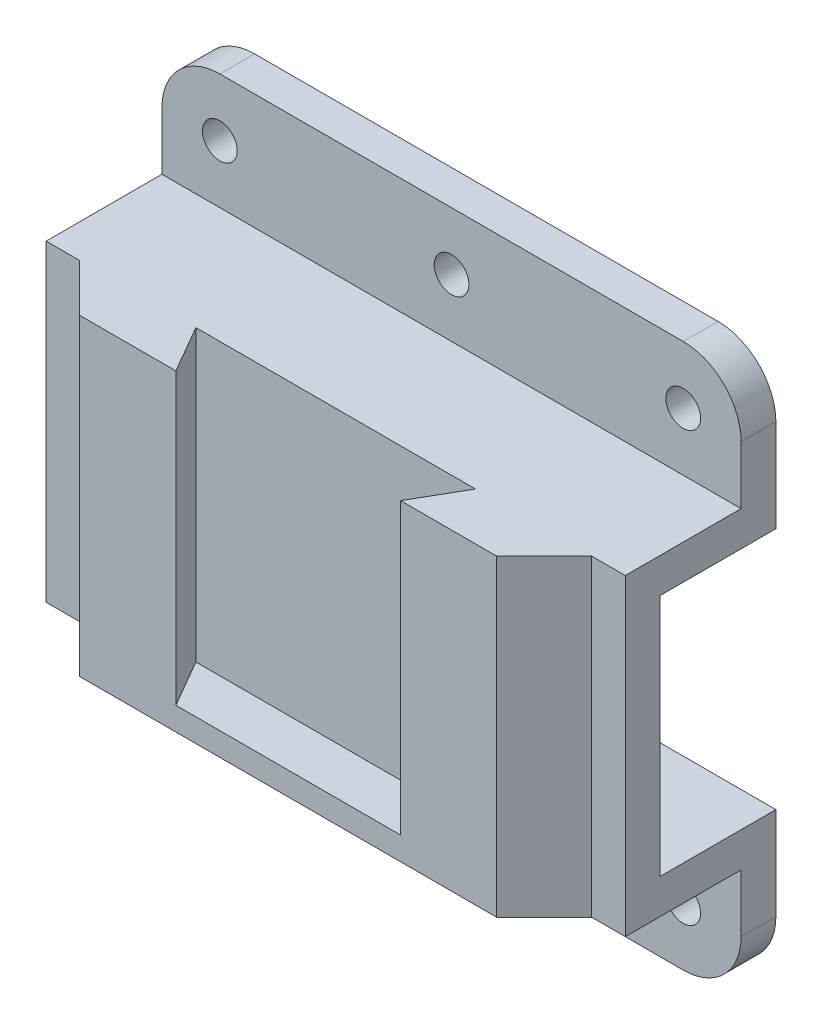
ISO-10303-21;
HEADER;
FILE_DESCRIPTION(('STEP AP214'),'2;1');
FILE_NAME('part.step','',(''),(''),'','','');
FILE_SCHEMA(('AUTOMOTIVE_DESIGN { 1 0 10303 214 1 1 1 1 }'));
ENDSEC;
DATA;
#1=APPLICATION_CONTEXT('core data for automotive mechanical design processes');
#2=APPLICATION_PROTOCOL_DEFINITION('international standard','automotive_design',2000,#1);
#3=PRODUCT_CONTEXT('',#1,'mechanical');
#4=PRODUCT('Part','Part','',(#3));
#5=PRODUCT_RELATED_PRODUCT_CATEGORY('part','',(#4));
#6=PRODUCT_DEFINITION_FORMATION('','',#4);
#7=PRODUCT_DEFINITION_CONTEXT('part definition',#1,'design');
#8=PRODUCT_DEFINITION('design','',#6,#7);
#9=PRODUCT_DEFINITION_SHAPE('','',#8);
#10=(LENGTH_UNIT() NAMED_UNIT(*) SI_UNIT(.MILLI.,.METRE.));
#11=(NAMED_UNIT(*) PLANE_ANGLE_UNIT() SI_UNIT($,.RADIAN.));
#12=(NAMED_UNIT(*) SI_UNIT($,.STERADIAN.) SOLID_ANGLE_UNIT());
#13=UNCERTAINTY_MEASURE_WITH_UNIT(LENGTH_MEASURE(1.E-05),#10,'distance_accuracy_value','');
#14=(GEOMETRIC_REPRESENTATION_CONTEXT(3) GLOBAL_UNCERTAINTY_ASSIGNED_CONTEXT((#13)) GLOBAL_UNIT_ASSIGNED_CONTEXT((#10,
#11,#12)) REPRESENTATION_CONTEXT('',''));
#15=CARTESIAN_POINT('',(0.,0.,0.));
#16=DIRECTION('',(0.,0.,1.));
#17=DIRECTION('',(1.,0.,0.));
#18=AXIS2_PLACEMENT_3D('',#15,#16,#17);
#19=CARTESIAN_POINT('',(50.,-13.5,13.));
#20=DIRECTION('',(0.,0.,-1.));
#21=DIRECTION('',(0.,1.,0.));
#22=AXIS2_PLACEMENT_3D('',#19,#20,#21);
#23=PLANE('',#22);
#24=DIRECTION('',(0.,1.,0.));
#25=VECTOR('',#24,1.);
#26=CARTESIAN_POINT('',(12.9328638963225,-13.5,13.));
#27=LINE('',#26,#25);
#28=CARTESIAN_POINT('',(12.9328638963225,-11.5,13.));
#29=VERTEX_POINT('',#28);
#30=CARTESIAN_POINT('',(12.9328638963225,13.5,13.));
#31=VERTEX_POINT('',#30);
#32=EDGE_CURVE('E211',#29,#31,#27,.T.);
#33=ORIENTED_EDGE('',*,*,#32,.F.);
#34=DIRECTION('',(1.,0.,0.));
#35=VECTOR('',#34,1.);
#36=CARTESIAN_POINT('',(12.9328638963225,-11.5,13.));
#37=LINE('',#36,#35);
#38=CARTESIAN_POINT('',(37.0671361036774,-11.5,13.));
#39=VERTEX_POINT('',#38);
#40=EDGE_CURVE('E195',#29,#39,#37,.T.);
#41=ORIENTED_EDGE('',*,*,#40,.T.);
#42=DIRECTION('',(0.,1.,0.));
#43=VECTOR('',#42,1.);
#44=CARTESIAN_POINT('',(37.0671361036774,-13.5,13.));
#45=LINE('',#44,#43);
#46=CARTESIAN_POINT('',(37.0671361036774,13.5,13.));
#47=VERTEX_POINT('',#46);
#48=EDGE_CURVE('E409',#39,#47,#45,.T.);
#49=ORIENTED_EDGE('',*,*,#48,.T.);
#50=DIRECTION('',(-1.,0.,0.));
#51=VECTOR('',#50,1.);
#52=CARTESIAN_POINT('',(50.,13.5,13.));
#53=LINE('',#52,#51);
#54=EDGE_CURVE('E217',#47,#31,#53,.T.);
#55=ORIENTED_EDGE('',*,*,#54,.T.);
#56=EDGE_LOOP('',(#33,#41,#49,#55));
#57=FACE_BOUND('',#56,.T.);
#58=ADVANCED_FACE('F39',(#57),#23,.F.);
#59=CARTESIAN_POINT('',(50.,13.5,13.));
#60=VERTEX_POINT('',#59);
#61=CARTESIAN_POINT('',(47.1,13.5,13.));
#62=VERTEX_POINT('',#61);
#63=EDGE_CURVE('E322',#60,#62,#53,.T.);
#64=ORIENTED_EDGE('',*,*,#63,.T.);
#65=DIRECTION('',(0.,-1.,0.));
#66=VECTOR('',#65,1.);
#67=CARTESIAN_POINT('',(47.1,-13.5,13.));
#68=LINE('',#67,#66);
#69=CARTESIAN_POINT('',(47.1,-13.5,13.));
#70=VERTEX_POINT('',#69);
#71=EDGE_CURVE('E11',#62,#70,#68,.T.);
#72=ORIENTED_EDGE('',*,*,#71,.T.);
#73=DIRECTION('',(-1.,0.,0.));
#74=VECTOR('',#73,1.);
#75=CARTESIAN_POINT('',(50.,-13.5,13.));
#76=LINE('',#75,#74);
#77=CARTESIAN_POINT('',(50.,-13.5,13.));
#78=VERTEX_POINT('',#77);
#79=EDGE_CURVE('E319',#78,#70,#76,.T.);
#80=ORIENTED_EDGE('',*,*,#79,.F.);
#81=DIRECTION('',(0.,-1.,0.));
#82=VECTOR('',#81,1.);
#83=CARTESIAN_POINT('',(50.,5.,13.));
#84=LINE('',#83,#82);
#85=EDGE_CURVE('E266',#60,#78,#84,.T.);
#86=ORIENTED_EDGE('',*,*,#85,.F.);
#87=EDGE_LOOP('',(#64,#72,#80,#86));
#88=FACE_BOUND('',#87,.T.);
#89=ADVANCED_FACE('F435',(#88),#23,.F.);
#90=CARTESIAN_POINT('',(0.,0.,0.));
#91=DIRECTION('',(1.,0.,0.));
#92=DIRECTION('',(0.,0.,-1.));
#93=AXIS2_PLACEMENT_3D('',#90,#91,#92);
#94=PLANE('',#93);
#95=DIRECTION('',(0.,0.,-1.));
#96=VECTOR('',#95,1.);
#97=CARTESIAN_POINT('',(0.,-13.5,3.00000000000001));
#98=LINE('',#97,#96);
#99=CARTESIAN_POINT('',(0.,-13.5,13.));
#100=VERTEX_POINT('',#99);
#101=CARTESIAN_POINT('',(0.,-13.5,3.00000000000001));
#102=VERTEX_POINT('',#101);
#103=EDGE_CURVE('E292',#100,#102,#98,.T.);
#104=ORIENTED_EDGE('',*,*,#103,.F.);
#105=DIRECTION('',(0.,-1.,0.));
#106=VECTOR('',#105,1.);
#107=CARTESIAN_POINT('',(0.,5.,13.));
#108=LINE('',#107,#106);
#109=CARTESIAN_POINT('',(0.,13.5,13.));
#110=VERTEX_POINT('',#109);
#111=EDGE_CURVE('E290',#110,#100,#108,.T.);
#112=ORIENTED_EDGE('',*,*,#111,.F.);
#113=DIRECTION('',(0.,0.,1.));
#114=VECTOR('',#113,1.);
#115=CARTESIAN_POINT('',(0.,13.5,3.));
#116=LINE('',#115,#114);
#117=CARTESIAN_POINT('',(0.,13.5,3.));
#118=VERTEX_POINT('',#117);
#119=EDGE_CURVE('E287',#118,#110,#116,.T.);
#120=ORIENTED_EDGE('',*,*,#119,.F.);
#121=DIRECTION('',(0.,-1.,0.));
#122=VECTOR('',#121,1.);
#123=CARTESIAN_POINT('',(0.,23.5,3.));
#124=LINE('',#123,#122);
#125=CARTESIAN_POINT('',(0.,18.5,3.));
#126=VERTEX_POINT('',#125);
#127=EDGE_CURVE('E285',#126,#118,#124,.T.);
#128=ORIENTED_EDGE('',*,*,#127,.F.);
#129=DIRECTION('',(0.,0.,1.));
#130=VECTOR('',#129,1.);
#131=CARTESIAN_POINT('',(0.,18.5,0.));
#132=LINE('',#131,#130);
#133=CARTESIAN_POINT('',(0.,18.5,0.));
#134=VERTEX_POINT('',#133);
#135=EDGE_CURVE('E346',#126,#134,#132,.F.);
#136=ORIENTED_EDGE('',*,*,#135,.T.);
#137=DIRECTION('',(0.,1.,0.));
#138=VECTOR('',#137,1.);
#139=CARTESIAN_POINT('',(0.,10.5,0.));
#140=LINE('',#139,#138);
#141=CARTESIAN_POINT('',(0.,10.5,0.));
#142=VERTEX_POINT('',#141);
#143=EDGE_CURVE('E282',#142,#134,#140,.T.);
#144=ORIENTED_EDGE('',*,*,#143,.F.);
#145=DIRECTION('',(0.,0.,-1.));
#146=VECTOR('',#145,1.);
#147=CARTESIAN_POINT('',(0.,10.5,10.));
#148=LINE('',#147,#146);
#149=CARTESIAN_POINT('',(0.,10.5,10.));
#150=VERTEX_POINT('',#149);
#151=EDGE_CURVE('E254',#150,#142,#148,.T.);
#152=ORIENTED_EDGE('',*,*,#151,.F.);
#153=DIRECTION('',(0.,1.,0.));
#154=VECTOR('',#153,1.);
#155=CARTESIAN_POINT('',(0.,-10.5,10.));
#156=LINE('',#155,#154);
#157=CARTESIAN_POINT('',(0.,-10.5,10.));
#158=VERTEX_POINT('',#157);
#159=EDGE_CURVE('E259',#158,#150,#156,.T.);
#160=ORIENTED_EDGE('',*,*,#159,.F.);
#161=DIRECTION('',(0.,0.,1.));
#162=VECTOR('',#161,1.);
#163=CARTESIAN_POINT('',(0.,-10.5,10.));
#164=LINE('',#163,#162);
#165=CARTESIAN_POINT('',(0.,-10.5,0.));
#166=VERTEX_POINT('',#165);
#167=EDGE_CURVE('E299',#166,#158,#164,.T.);
#168=ORIENTED_EDGE('',*,*,#167,.F.);
#169=DIRECTION('',(0.,1.,0.));
#170=VECTOR('',#169,1.);
#171=CARTESIAN_POINT('',(0.,-10.5,0.));
#172=LINE('',#171,#170);
#173=CARTESIAN_POINT('',(0.,-18.5,0.));
#174=VERTEX_POINT('',#173);
#175=EDGE_CURVE('E297',#174,#166,#172,.T.);
#176=ORIENTED_EDGE('',*,*,#175,.F.);
#177=DIRECTION('',(0.,0.,-1.));
#178=VECTOR('',#177,1.);
#179=CARTESIAN_POINT('',(0.,-18.5,0.));
#180=LINE('',#179,#178);
#181=CARTESIAN_POINT('',(0.,-18.5,3.00000000000001));
#182=VERTEX_POINT('',#181);
#183=EDGE_CURVE('E348',#174,#182,#180,.F.);
#184=ORIENTED_EDGE('',*,*,#183,.T.);
#185=DIRECTION('',(0.,-1.,0.));
#186=VECTOR('',#185,1.);
#187=CARTESIAN_POINT('',(0.,-23.5,3.00000000000001));
#188=LINE('',#187,#186);
#189=EDGE_CURVE('E294',#102,#182,#188,.T.);
#190=ORIENTED_EDGE('',*,*,#189,.F.);
#191=EDGE_LOOP('',(#104,#112,#120,#128,#136,#144,#152,#160,#168,#176,#184,#190));
#192=FACE_BOUND('',#191,.T.);
#193=ADVANCED_FACE('F449',(#192),#94,.F.);
#194=CARTESIAN_POINT('',(50.,0.,0.));
#195=DIRECTION('',(1.,0.,0.));
#196=DIRECTION('',(0.,0.,-1.));
#197=AXIS2_PLACEMENT_3D('',#194,#195,#196);
#198=PLANE('',#197);
#199=ORIENTED_EDGE('',*,*,#85,.T.);
#200=DIRECTION('',(0.,0.,-1.));
#201=VECTOR('',#200,1.);
#202=CARTESIAN_POINT('',(50.,-13.5,3.00000000000001));
#203=LINE('',#202,#201);
#204=CARTESIAN_POINT('',(50.,-13.5,3.00000000000001));
#205=VERTEX_POINT('',#204);
#206=EDGE_CURVE('E268',#78,#205,#203,.T.);
#207=ORIENTED_EDGE('',*,*,#206,.T.);
#208=DIRECTION('',(0.,-1.,0.));
#209=VECTOR('',#208,1.);
#210=CARTESIAN_POINT('',(50.,-23.5,3.00000000000001));
#211=LINE('',#210,#209);
#212=CARTESIAN_POINT('',(50.,-18.5,3.00000000000001));
#213=VERTEX_POINT('',#212);
#214=EDGE_CURVE('E270',#205,#213,#211,.T.);
#215=ORIENTED_EDGE('',*,*,#214,.T.);
#216=DIRECTION('',(0.,0.,-1.));
#217=VECTOR('',#216,1.);
#218=CARTESIAN_POINT('',(50.,-18.5,0.));
#219=LINE('',#218,#217);
#220=CARTESIAN_POINT('',(50.,-18.5,0.));
#221=VERTEX_POINT('',#220);
#222=EDGE_CURVE('E357',#213,#221,#219,.T.);
#223=ORIENTED_EDGE('',*,*,#222,.T.);
#224=DIRECTION('',(0.,1.,0.));
#225=VECTOR('',#224,1.);
#226=CARTESIAN_POINT('',(50.,-10.5,0.));
#227=LINE('',#226,#225);
#228=CARTESIAN_POINT('',(50.,-10.5,0.));
#229=VERTEX_POINT('',#228);
#230=EDGE_CURVE('E273',#221,#229,#227,.T.);
#231=ORIENTED_EDGE('',*,*,#230,.T.);
#232=DIRECTION('',(0.,0.,1.));
#233=VECTOR('',#232,1.);
#234=CARTESIAN_POINT('',(50.,-10.5,10.));
#235=LINE('',#234,#233);
#236=CARTESIAN_POINT('',(50.,-10.5,10.));
#237=VERTEX_POINT('',#236);
#238=EDGE_CURVE('E275',#229,#237,#235,.T.);
#239=ORIENTED_EDGE('',*,*,#238,.T.);
#240=DIRECTION('',(0.,1.,0.));
#241=VECTOR('',#240,1.);
#242=CARTESIAN_POINT('',(50.,-10.5,10.));
#243=LINE('',#242,#241);
#244=CARTESIAN_POINT('',(50.,10.5,10.));
#245=VERTEX_POINT('',#244);
#246=EDGE_CURVE('E277',#237,#245,#243,.T.);
#247=ORIENTED_EDGE('',*,*,#246,.T.);
#248=DIRECTION('',(0.,0.,-1.));
#249=VECTOR('',#248,1.);
#250=CARTESIAN_POINT('',(50.,10.5,10.));
#251=LINE('',#250,#249);
#252=CARTESIAN_POINT('',(50.,10.5,0.));
#253=VERTEX_POINT('',#252);
#254=EDGE_CURVE('E255',#245,#253,#251,.T.);
#255=ORIENTED_EDGE('',*,*,#254,.T.);
#256=DIRECTION('',(0.,1.,0.));
#257=VECTOR('',#256,1.);
#258=CARTESIAN_POINT('',(50.,10.5,0.));
#259=LINE('',#258,#257);
#260=CARTESIAN_POINT('',(50.,18.5,0.));
#261=VERTEX_POINT('',#260);
#262=EDGE_CURVE('E258',#253,#261,#259,.T.);
#263=ORIENTED_EDGE('',*,*,#262,.T.);
#264=DIRECTION('',(0.,0.,1.));
#265=VECTOR('',#264,1.);
#266=CARTESIAN_POINT('',(50.,18.5,3.));
#267=LINE('',#266,#265);
#268=CARTESIAN_POINT('',(50.,18.5,3.));
#269=VERTEX_POINT('',#268);
#270=EDGE_CURVE('E354',#261,#269,#267,.T.);
#271=ORIENTED_EDGE('',*,*,#270,.T.);
#272=DIRECTION('',(0.,-1.,0.));
#273=VECTOR('',#272,1.);
#274=CARTESIAN_POINT('',(50.,23.5,3.));
#275=LINE('',#274,#273);
#276=CARTESIAN_POINT('',(50.,13.5,3.));
#277=VERTEX_POINT('',#276);
#278=EDGE_CURVE('E262',#269,#277,#275,.T.);
#279=ORIENTED_EDGE('',*,*,#278,.T.);
#280=DIRECTION('',(0.,0.,1.));
#281=VECTOR('',#280,1.);
#282=CARTESIAN_POINT('',(50.,13.5,3.));
#283=LINE('',#282,#281);
#284=EDGE_CURVE('E264',#277,#60,#283,.T.);
#285=ORIENTED_EDGE('',*,*,#284,.T.);
#286=EDGE_LOOP('',(#199,#207,#215,#223,#231,#239,#247,#255,#263,#271,#279,#285));
#287=FACE_BOUND('',#286,.T.);
#288=ADVANCED_FACE('F439',(#287),#198,.T.);
#289=CARTESIAN_POINT('',(50.,10.5,10.));
#290=DIRECTION('',(0.,1.,0.));
#291=DIRECTION('',(0.,0.,1.));
#292=AXIS2_PLACEMENT_3D('',#289,#290,#291);
#293=PLANE('',#292);
#294=ORIENTED_EDGE('',*,*,#151,.T.);
#295=DIRECTION('',(-1.,0.,0.));
#296=VECTOR('',#295,1.);
#297=CARTESIAN_POINT('',(50.,10.5,0.));
#298=LINE('',#297,#296);
#299=EDGE_CURVE('E334',#253,#142,#298,.T.);
#300=ORIENTED_EDGE('',*,*,#299,.F.);
#301=ORIENTED_EDGE('',*,*,#254,.F.);
#302=DIRECTION('',(-1.,0.,0.));
#303=VECTOR('',#302,1.);
#304=CARTESIAN_POINT('',(50.,10.5,10.));
#305=LINE('',#304,#303);
#306=EDGE_CURVE('E279',#245,#150,#305,.T.);
#307=ORIENTED_EDGE('',*,*,#306,.T.);
#308=EDGE_LOOP('',(#294,#300,#301,#307));
#309=FACE_BOUND('',#308,.T.);
#310=ADVANCED_FACE('F491',(#309),#293,.F.);
#311=CARTESIAN_POINT('',(50.,10.5,0.));
#312=DIRECTION('',(0.,0.,1.));
#313=DIRECTION('',(1.,0.,0.));
#314=AXIS2_PLACEMENT_3D('',#311,#312,#313);
#315=PLANE('',#314);
#316=CARTESIAN_POINT('',(25.,18.5,0.));
#317=DIRECTION('',(0.,0.,1.));
#318=DIRECTION('',(1.,0.,0.));
#319=AXIS2_PLACEMENT_3D('',#316,#317,#318);
#320=CIRCLE('',#319,1.5);
#321=CARTESIAN_POINT('',(26.5,18.5,0.));
#322=VERTEX_POINT('',#321);
#323=EDGE_CURVE('E244',#322,#322,#320,.T.);
#324=ORIENTED_EDGE('',*,*,#323,.T.);
#325=EDGE_LOOP('',(#324));
#326=FACE_BOUND('',#325,.T.);
#327=CARTESIAN_POINT('',(45.,18.5,0.));
#328=DIRECTION('',(0.,0.,1.));
#329=DIRECTION('',(1.,0.,0.));
#330=AXIS2_PLACEMENT_3D('',#327,#328,#329);
#331=CIRCLE('',#330,1.5);
#332=CARTESIAN_POINT('',(46.5,18.5,0.));
#333=VERTEX_POINT('',#332);
#334=EDGE_CURVE('E241',#333,#333,#331,.T.);
#335=ORIENTED_EDGE('',*,*,#334,.T.);
#336=EDGE_LOOP('',(#335));
#337=FACE_BOUND('',#336,.T.);
#338=CARTESIAN_POINT('',(5.,18.5,0.));
#339=DIRECTION('',(0.,0.,1.));
#340=DIRECTION('',(1.,0.,0.));
#341=AXIS2_PLACEMENT_3D('',#338,#339,#340);
#342=CIRCLE('',#341,1.5);
#343=CARTESIAN_POINT('',(6.5,18.5,0.));
#344=VERTEX_POINT('',#343);
#345=EDGE_CURVE('E251',#344,#344,#342,.T.);
#346=ORIENTED_EDGE('',*,*,#345,.T.);
#347=EDGE_LOOP('',(#346));
#348=FACE_BOUND('',#347,.T.);
#349=ORIENTED_EDGE('',*,*,#143,.T.);
#350=CARTESIAN_POINT('',(5.,18.5,0.));
#351=DIRECTION('',(0.,0.,1.));
#352=DIRECTION('',(1.,0.,0.));
#353=AXIS2_PLACEMENT_3D('',#350,#351,#352);
#354=CIRCLE('',#353,5.);
#355=CARTESIAN_POINT('',(5.,23.5,0.));
#356=VERTEX_POINT('',#355);
#357=EDGE_CURVE('E371',#134,#356,#354,.F.);
#358=ORIENTED_EDGE('',*,*,#357,.T.);
#359=DIRECTION('',(-1.,0.,0.));
#360=VECTOR('',#359,1.);
#361=CARTESIAN_POINT('',(50.,23.5,0.));
#362=LINE('',#361,#360);
#363=CARTESIAN_POINT('',(45.,23.5,0.));
#364=VERTEX_POINT('',#363);
#365=EDGE_CURVE('E331',#364,#356,#362,.T.);
#366=ORIENTED_EDGE('',*,*,#365,.F.);
#367=CARTESIAN_POINT('',(45.,18.5,0.));
#368=DIRECTION('',(0.,0.,1.));
#369=DIRECTION('',(1.,0.,0.));
#370=AXIS2_PLACEMENT_3D('',#367,#368,#369);
#371=CIRCLE('',#370,5.);
#372=EDGE_CURVE('E369',#364,#261,#371,.F.);
#373=ORIENTED_EDGE('',*,*,#372,.T.);
#374=ORIENTED_EDGE('',*,*,#262,.F.);
#375=ORIENTED_EDGE('',*,*,#299,.T.);
#376=EDGE_LOOP('',(#349,#358,#366,#373,#374,#375));
#377=FACE_BOUND('',#376,.T.);
#378=ADVANCED_FACE('F493',(#326,#337,#348,#377),#315,.F.);
#379=CARTESIAN_POINT('',(50.,23.5,0.));
#380=DIRECTION('',(0.,-1.,0.));
#381=DIRECTION('',(0.,0.,-1.));
#382=AXIS2_PLACEMENT_3D('',#379,#380,#381);
#383=PLANE('',#382);
#384=ORIENTED_EDGE('',*,*,#365,.T.);
#385=DIRECTION('',(0.,0.,1.));
#386=VECTOR('',#385,1.);
#387=CARTESIAN_POINT('',(5.,23.5,0.));
#388=LINE('',#387,#386);
#389=CARTESIAN_POINT('',(5.,23.5,3.));
#390=VERTEX_POINT('',#389);
#391=EDGE_CURVE('E362',#356,#390,#388,.T.);
#392=ORIENTED_EDGE('',*,*,#391,.T.);
#393=DIRECTION('',(-1.,0.,0.));
#394=VECTOR('',#393,1.);
#395=CARTESIAN_POINT('',(50.,23.5,3.));
#396=LINE('',#395,#394);
#397=CARTESIAN_POINT('',(45.,23.5,3.));
#398=VERTEX_POINT('',#397);
#399=EDGE_CURVE('E328',#398,#390,#396,.T.);
#400=ORIENTED_EDGE('',*,*,#399,.F.);
#401=DIRECTION('',(0.,0.,1.));
#402=VECTOR('',#401,1.);
#403=CARTESIAN_POINT('',(45.,23.5,0.));
#404=LINE('',#403,#402);
#405=EDGE_CURVE('E360',#398,#364,#404,.F.);
#406=ORIENTED_EDGE('',*,*,#405,.T.);
#407=EDGE_LOOP('',(#384,#392,#400,#406));
#408=FACE_BOUND('',#407,.T.);
#409=ADVANCED_FACE('F503',(#408),#383,.F.);
#410=CARTESIAN_POINT('',(50.,23.5,3.));
#411=DIRECTION('',(0.,0.,-1.));
#412=DIRECTION('',(0.,1.,0.));
#413=AXIS2_PLACEMENT_3D('',#410,#411,#412);
#414=PLANE('',#413);
#415=CARTESIAN_POINT('',(25.,18.5,3.));
#416=DIRECTION('',(0.,0.,1.));
#417=DIRECTION('',(1.,0.,0.));
#418=AXIS2_PLACEMENT_3D('',#415,#416,#417);
#419=CIRCLE('',#418,1.5);
#420=CARTESIAN_POINT('',(26.5,18.5,3.));
#421=VERTEX_POINT('',#420);
#422=EDGE_CURVE('E219',#421,#421,#419,.T.);
#423=ORIENTED_EDGE('',*,*,#422,.F.);
#424=EDGE_LOOP('',(#423));
#425=FACE_BOUND('',#424,.T.);
#426=CARTESIAN_POINT('',(45.,18.5,3.));
#427=DIRECTION('',(0.,0.,1.));
#428=DIRECTION('',(1.,0.,0.));
#429=AXIS2_PLACEMENT_3D('',#426,#427,#428);
#430=CIRCLE('',#429,1.5);
#431=CARTESIAN_POINT('',(46.5,18.5,3.));
#432=VERTEX_POINT('',#431);
#433=EDGE_CURVE('E235',#432,#432,#430,.T.);
#434=ORIENTED_EDGE('',*,*,#433,.F.);
#435=EDGE_LOOP('',(#434));
#436=FACE_BOUND('',#435,.T.);
#437=CARTESIAN_POINT('',(5.,18.5,3.));
#438=DIRECTION('',(0.,0.,1.));
#439=DIRECTION('',(1.,0.,0.));
#440=AXIS2_PLACEMENT_3D('',#437,#438,#439);
#441=CIRCLE('',#440,1.5);
#442=CARTESIAN_POINT('',(6.5,18.5,3.));
#443=VERTEX_POINT('',#442);
#444=EDGE_CURVE('E248',#443,#443,#441,.T.);
#445=ORIENTED_EDGE('',*,*,#444,.F.);
#446=EDGE_LOOP('',(#445));
#447=FACE_BOUND('',#446,.T.);
#448=ORIENTED_EDGE('',*,*,#399,.T.);
#449=CARTESIAN_POINT('',(5.,18.5,3.));
#450=DIRECTION('',(0.,0.,-1.));
#451=DIRECTION('',(0.,1.,0.));
#452=AXIS2_PLACEMENT_3D('',#449,#450,#451);
#453=CIRCLE('',#452,5.);
#454=EDGE_CURVE('E367',#390,#126,#453,.F.);
#455=ORIENTED_EDGE('',*,*,#454,.T.);
#456=ORIENTED_EDGE('',*,*,#127,.T.);
#457=DIRECTION('',(-1.,0.,0.));
#458=VECTOR('',#457,1.);
#459=CARTESIAN_POINT('',(50.,13.5,3.));
#460=LINE('',#459,#458);
#461=EDGE_CURVE('E325',#277,#118,#460,.T.);
#462=ORIENTED_EDGE('',*,*,#461,.F.);
#463=ORIENTED_EDGE('',*,*,#278,.F.);
#464=CARTESIAN_POINT('',(45.,18.5,3.));
#465=DIRECTION('',(0.,0.,-1.));
#466=DIRECTION('',(0.,1.,0.));
#467=AXIS2_PLACEMENT_3D('',#464,#465,#466);
#468=CIRCLE('',#467,5.);
#469=EDGE_CURVE('E365',#269,#398,#468,.F.);
#470=ORIENTED_EDGE('',*,*,#469,.T.);
#471=EDGE_LOOP('',(#448,#455,#456,#462,#463,#470));
#472=FACE_BOUND('',#471,.T.);
#473=ADVANCED_FACE('F500',(#425,#436,#447,#472),#414,.F.);
#474=CARTESIAN_POINT('',(50.,13.5,3.));
#475=DIRECTION('',(0.,-1.,0.));
#476=DIRECTION('',(0.,0.,-1.));
#477=AXIS2_PLACEMENT_3D('',#474,#475,#476);
#478=PLANE('',#477);
#479=CARTESIAN_POINT('',(2.90000000000007,13.5,13.));
#480=VERTEX_POINT('',#479);
#481=EDGE_CURVE('E321',#480,#110,#53,.T.);
#482=ORIENTED_EDGE('',*,*,#481,.F.);
#483=DIRECTION('',(-0.707106781186544,0.,-0.707106781186551));
#484=VECTOR('',#483,1.);
#485=CARTESIAN_POINT('',(2.5,13.5,12.5999999999999));
#486=LINE('',#485,#484);
#487=CARTESIAN_POINT('',(7.00000000000003,13.5,17.1));
#488=VERTEX_POINT('',#487);
#489=EDGE_CURVE('E383',#480,#488,#486,.F.);
#490=ORIENTED_EDGE('',*,*,#489,.T.);
#491=DIRECTION('',(1.,0.,0.));
#492=VECTOR('',#491,1.);
#493=CARTESIAN_POINT('',(0.,13.5,17.1));
#494=LINE('',#493,#492);
#495=CARTESIAN_POINT('',(15.3,13.5,17.1));
#496=VERTEX_POINT('',#495);
#497=EDGE_CURVE('E406',#488,#496,#494,.T.);
#498=ORIENTED_EDGE('',*,*,#497,.T.);
#499=DIRECTION('',(-0.500000000000004,0.,-0.866025403784436));
#500=VECTOR('',#499,1.);
#501=CARTESIAN_POINT('',(4.07048279764294,13.5,-2.35009433895092));
#502=LINE('',#501,#500);
#503=EDGE_CURVE('E224',#496,#31,#502,.T.);
#504=ORIENTED_EDGE('',*,*,#503,.T.);
#505=ORIENTED_EDGE('',*,*,#54,.F.);
#506=DIRECTION('',(0.499999999999998,0.,-0.86602540378444));
#507=VECTOR('',#506,1.);
#508=CARTESIAN_POINT('',(33.429517202357,13.5,19.3005407556599));
#509=LINE('',#508,#507);
#510=CARTESIAN_POINT('',(34.7,13.5,17.1));
#511=VERTEX_POINT('',#510);
#512=EDGE_CURVE('E214',#511,#47,#509,.T.);
#513=ORIENTED_EDGE('',*,*,#512,.F.);
#514=DIRECTION('',(1.,0.,0.));
#515=VECTOR('',#514,1.);
#516=CARTESIAN_POINT('',(0.,13.5,17.1));
#517=LINE('',#516,#515);
#518=CARTESIAN_POINT('',(42.9999999999999,13.5,17.1));
#519=VERTEX_POINT('',#518);
#520=EDGE_CURVE('E415',#511,#519,#517,.T.);
#521=ORIENTED_EDGE('',*,*,#520,.T.);
#522=DIRECTION('',(0.707106781186551,0.,-0.707106781186544));
#523=VECTOR('',#522,1.);
#524=CARTESIAN_POINT('',(42.9999999999999,13.5,17.1));
#525=LINE('',#524,#523);
#526=EDGE_CURVE('E373',#519,#62,#525,.T.);
#527=ORIENTED_EDGE('',*,*,#526,.T.);
#528=ORIENTED_EDGE('',*,*,#63,.F.);
#529=ORIENTED_EDGE('',*,*,#284,.F.);
#530=ORIENTED_EDGE('',*,*,#461,.T.);
#531=ORIENTED_EDGE('',*,*,#119,.T.);
#532=EDGE_LOOP('',(#482,#490,#498,#504,#505,#513,#521,#527,#528,#529,#530,#531));
#533=FACE_BOUND('',#532,.T.);
#534=ADVANCED_FACE('F405',(#533),#478,.F.);
#535=CARTESIAN_POINT('',(2.90000000000008,-13.5,13.));
#536=VERTEX_POINT('',#535);
#537=EDGE_CURVE('E55',#536,#100,#76,.T.);
#538=ORIENTED_EDGE('',*,*,#537,.F.);
#539=DIRECTION('',(0.,-1.,0.));
#540=VECTOR('',#539,1.);
#541=CARTESIAN_POINT('',(2.90000000000008,-13.5,13.));
#542=LINE('',#541,#540);
#543=EDGE_CURVE('E48',#536,#480,#542,.F.);
#544=ORIENTED_EDGE('',*,*,#543,.T.);
#545=ORIENTED_EDGE('',*,*,#481,.T.);
#546=ORIENTED_EDGE('',*,*,#111,.T.);
#547=EDGE_LOOP('',(#538,#544,#545,#546));
#548=FACE_BOUND('',#547,.T.);
#549=ADVANCED_FACE('F397',(#548),#23,.F.);
#550=CARTESIAN_POINT('',(50.,-13.5,3.00000000000001));
#551=DIRECTION('',(0.,1.,0.));
#552=DIRECTION('',(0.,0.,1.));
#553=AXIS2_PLACEMENT_3D('',#550,#551,#552);
#554=PLANE('',#553);
#555=DIRECTION('',(1.,0.,0.));
#556=VECTOR('',#555,1.);
#557=CARTESIAN_POINT('',(0.,-13.5,17.1));
#558=LINE('',#557,#556);
#559=CARTESIAN_POINT('',(7.00000000000003,-13.5,17.1));
#560=VERTEX_POINT('',#559);
#561=CARTESIAN_POINT('',(42.9999999999999,-13.5,17.1));
#562=VERTEX_POINT('',#561);
#563=EDGE_CURVE('E413',#560,#562,#558,.T.);
#564=ORIENTED_EDGE('',*,*,#563,.F.);
#565=DIRECTION('',(0.707106781186544,0.,0.707106781186551));
#566=VECTOR('',#565,1.);
#567=CARTESIAN_POINT('',(2.5,-13.5,12.5999999999999));
#568=LINE('',#567,#566);
#569=EDGE_CURVE('E391',#560,#536,#568,.F.);
#570=ORIENTED_EDGE('',*,*,#569,.T.);
#571=ORIENTED_EDGE('',*,*,#537,.T.);
#572=ORIENTED_EDGE('',*,*,#103,.T.);
#573=DIRECTION('',(-1.,0.,0.));
#574=VECTOR('',#573,1.);
#575=CARTESIAN_POINT('',(50.,-13.5,3.00000000000001));
#576=LINE('',#575,#574);
#577=EDGE_CURVE('E316',#205,#102,#576,.T.);
#578=ORIENTED_EDGE('',*,*,#577,.F.);
#579=ORIENTED_EDGE('',*,*,#206,.F.);
#580=ORIENTED_EDGE('',*,*,#79,.T.);
#581=DIRECTION('',(-0.707106781186551,0.,0.707106781186544));
#582=VECTOR('',#581,1.);
#583=CARTESIAN_POINT('',(42.9999999999999,-13.5,17.1));
#584=LINE('',#583,#582);
#585=EDGE_CURVE('E388',#70,#562,#584,.T.);
#586=ORIENTED_EDGE('',*,*,#585,.T.);
#587=EDGE_LOOP('',(#564,#570,#571,#572,#578,#579,#580,#586));
#588=FACE_BOUND('',#587,.T.);
#589=ADVANCED_FACE('F453',(#588),#554,.F.);
#590=CARTESIAN_POINT('',(50.,-23.5,3.00000000000001));
#591=DIRECTION('',(0.,0.,-1.));
#592=DIRECTION('',(0.,1.,0.));
#593=AXIS2_PLACEMENT_3D('',#590,#591,#592);
#594=PLANE('',#593);
#595=CARTESIAN_POINT('',(25.,-18.5,3.));
#596=DIRECTION('',(0.,0.,1.));
#597=DIRECTION('',(1.,0.,0.));
#598=AXIS2_PLACEMENT_3D('',#595,#596,#597);
#599=CIRCLE('',#598,1.5);
#600=CARTESIAN_POINT('',(26.5,-18.5,3.));
#601=VERTEX_POINT('',#600);
#602=EDGE_CURVE('E222',#601,#601,#599,.T.);
#603=ORIENTED_EDGE('',*,*,#602,.F.);
#604=EDGE_LOOP('',(#603));
#605=FACE_BOUND('',#604,.T.);
#606=CARTESIAN_POINT('',(45.,-18.5,3.));
#607=DIRECTION('',(0.,0.,1.));
#608=DIRECTION('',(1.,0.,0.));
#609=AXIS2_PLACEMENT_3D('',#606,#607,#608);
#610=CIRCLE('',#609,1.5);
#611=CARTESIAN_POINT('',(46.5,-18.5,3.));
#612=VERTEX_POINT('',#611);
#613=EDGE_CURVE('E229',#612,#612,#610,.T.);
#614=ORIENTED_EDGE('',*,*,#613,.F.);
#615=EDGE_LOOP('',(#614));
#616=FACE_BOUND('',#615,.T.);
#617=CARTESIAN_POINT('',(5.,-18.5,3.));
#618=DIRECTION('',(0.,0.,1.));
#619=DIRECTION('',(1.,0.,0.));
#620=AXIS2_PLACEMENT_3D('',#617,#618,#619);
#621=CIRCLE('',#620,1.5);
#622=CARTESIAN_POINT('',(6.5,-18.5,3.));
#623=VERTEX_POINT('',#622);
#624=EDGE_CURVE('E232',#623,#623,#621,.T.);
#625=ORIENTED_EDGE('',*,*,#624,.F.);
#626=EDGE_LOOP('',(#625));
#627=FACE_BOUND('',#626,.T.);
#628=ORIENTED_EDGE('',*,*,#189,.T.);
#629=CARTESIAN_POINT('',(5.,-18.5,3.00000000000001));
#630=DIRECTION('',(0.,0.,-1.));
#631=DIRECTION('',(0.,1.,0.));
#632=AXIS2_PLACEMENT_3D('',#629,#630,#631);
#633=CIRCLE('',#632,5.);
#634=CARTESIAN_POINT('',(5.,-23.5,3.00000000000001));
#635=VERTEX_POINT('',#634);
#636=EDGE_CURVE('E352',#182,#635,#633,.F.);
#637=ORIENTED_EDGE('',*,*,#636,.T.);
#638=DIRECTION('',(-1.,0.,0.));
#639=VECTOR('',#638,1.);
#640=CARTESIAN_POINT('',(50.,-23.5,3.00000000000001));
#641=LINE('',#640,#639);
#642=CARTESIAN_POINT('',(45.,-23.5,3.00000000000001));
#643=VERTEX_POINT('',#642);
#644=EDGE_CURVE('E313',#643,#635,#641,.T.);
#645=ORIENTED_EDGE('',*,*,#644,.F.);
#646=CARTESIAN_POINT('',(45.,-18.5,3.00000000000001));
#647=DIRECTION('',(0.,0.,-1.));
#648=DIRECTION('',(0.,1.,0.));
#649=AXIS2_PLACEMENT_3D('',#646,#647,#648);
#650=CIRCLE('',#649,5.);
#651=EDGE_CURVE('E350',#643,#213,#650,.F.);
#652=ORIENTED_EDGE('',*,*,#651,.T.);
#653=ORIENTED_EDGE('',*,*,#214,.F.);
#654=ORIENTED_EDGE('',*,*,#577,.T.);
#655=EDGE_LOOP('',(#628,#637,#645,#652,#653,#654));
#656=FACE_BOUND('',#655,.T.);
#657=ADVANCED_FACE('F456',(#605,#616,#627,#656),#594,.F.);
#658=CARTESIAN_POINT('',(50.,-23.5,0.));
#659=DIRECTION('',(0.,1.,0.));
#660=DIRECTION('',(0.,0.,1.));
#661=AXIS2_PLACEMENT_3D('',#658,#659,#660);
#662=PLANE('',#661);
#663=ORIENTED_EDGE('',*,*,#644,.T.);
#664=DIRECTION('',(0.,0.,-1.));
#665=VECTOR('',#664,1.);
#666=CARTESIAN_POINT('',(5.,-23.5,0.));
#667=LINE('',#666,#665);
#668=CARTESIAN_POINT('',(5.,-23.5,0.));
#669=VERTEX_POINT('',#668);
#670=EDGE_CURVE('E339',#635,#669,#667,.T.);
#671=ORIENTED_EDGE('',*,*,#670,.T.);
#672=DIRECTION('',(-1.,0.,0.));
#673=VECTOR('',#672,1.);
#674=CARTESIAN_POINT('',(50.,-23.5,0.));
#675=LINE('',#674,#673);
#676=CARTESIAN_POINT('',(45.,-23.5,0.));
#677=VERTEX_POINT('',#676);
#678=EDGE_CURVE('E310',#677,#669,#675,.T.);
#679=ORIENTED_EDGE('',*,*,#678,.F.);
#680=DIRECTION('',(0.,0.,-1.));
#681=VECTOR('',#680,1.);
#682=CARTESIAN_POINT('',(45.,-23.5,3.00000000000001));
#683=LINE('',#682,#681);
#684=EDGE_CURVE('E337',#677,#643,#683,.F.);
#685=ORIENTED_EDGE('',*,*,#684,.T.);
#686=EDGE_LOOP('',(#663,#671,#679,#685));
#687=FACE_BOUND('',#686,.T.);
#688=ADVANCED_FACE('F470',(#687),#662,.F.);
#689=CARTESIAN_POINT('',(50.,-10.5,0.));
#690=DIRECTION('',(0.,0.,1.));
#691=DIRECTION('',(1.,0.,0.));
#692=AXIS2_PLACEMENT_3D('',#689,#690,#691);
#693=PLANE('',#692);
#694=CARTESIAN_POINT('',(25.,-18.5,0.));
#695=DIRECTION('',(0.,0.,1.));
#696=DIRECTION('',(1.,0.,0.));
#697=AXIS2_PLACEMENT_3D('',#694,#695,#696);
#698=CIRCLE('',#697,1.5);
#699=CARTESIAN_POINT('',(26.5,-18.5,0.));
#700=VERTEX_POINT('',#699);
#701=EDGE_CURVE('E245',#700,#700,#698,.T.);
#702=ORIENTED_EDGE('',*,*,#701,.T.);
#703=EDGE_LOOP('',(#702));
#704=FACE_BOUND('',#703,.T.);
#705=CARTESIAN_POINT('',(45.,-18.5,0.));
#706=DIRECTION('',(0.,0.,1.));
#707=DIRECTION('',(1.,0.,0.));
#708=AXIS2_PLACEMENT_3D('',#705,#706,#707);
#709=CIRCLE('',#708,1.5);
#710=CARTESIAN_POINT('',(46.5,-18.5,0.));
#711=VERTEX_POINT('',#710);
#712=EDGE_CURVE('E376',#711,#711,#709,.T.);
#713=ORIENTED_EDGE('',*,*,#712,.T.);
#714=EDGE_LOOP('',(#713));
#715=FACE_BOUND('',#714,.T.);
#716=CARTESIAN_POINT('',(5.,-18.5,0.));
#717=DIRECTION('',(0.,0.,1.));
#718=DIRECTION('',(1.,0.,0.));
#719=AXIS2_PLACEMENT_3D('',#716,#717,#718);
#720=CIRCLE('',#719,1.5);
#721=CARTESIAN_POINT('',(6.5,-18.5,0.));
#722=VERTEX_POINT('',#721);
#723=EDGE_CURVE('E238',#722,#722,#720,.T.);
#724=ORIENTED_EDGE('',*,*,#723,.T.);
#725=EDGE_LOOP('',(#724));
#726=FACE_BOUND('',#725,.T.);
#727=ORIENTED_EDGE('',*,*,#678,.T.);
#728=CARTESIAN_POINT('',(5.,-18.5,0.));
#729=DIRECTION('',(0.,0.,1.));
#730=DIRECTION('',(1.,0.,0.));
#731=AXIS2_PLACEMENT_3D('',#728,#729,#730);
#732=CIRCLE('',#731,5.);
#733=EDGE_CURVE('E344',#669,#174,#732,.F.);
#734=ORIENTED_EDGE('',*,*,#733,.T.);
#735=ORIENTED_EDGE('',*,*,#175,.T.);
#736=DIRECTION('',(-1.,0.,0.));
#737=VECTOR('',#736,1.);
#738=CARTESIAN_POINT('',(50.,-10.5,0.));
#739=LINE('',#738,#737);
#740=EDGE_CURVE('E307',#229,#166,#739,.T.);
#741=ORIENTED_EDGE('',*,*,#740,.F.);
#742=ORIENTED_EDGE('',*,*,#230,.F.);
#743=CARTESIAN_POINT('',(45.,-18.5,0.));
#744=DIRECTION('',(0.,0.,1.));
#745=DIRECTION('',(1.,0.,0.));
#746=AXIS2_PLACEMENT_3D('',#743,#744,#745);
#747=CIRCLE('',#746,5.);
#748=EDGE_CURVE('E342',#221,#677,#747,.F.);
#749=ORIENTED_EDGE('',*,*,#748,.T.);
#750=EDGE_LOOP('',(#727,#734,#735,#741,#742,#749));
#751=FACE_BOUND('',#750,.T.);
#752=ADVANCED_FACE('F467',(#704,#715,#726,#751),#693,.F.);
#753=CARTESIAN_POINT('',(50.,-10.5,10.));
#754=DIRECTION('',(0.,-1.,0.));
#755=DIRECTION('',(0.,0.,-1.));
#756=AXIS2_PLACEMENT_3D('',#753,#754,#755);
#757=PLANE('',#756);
#758=ORIENTED_EDGE('',*,*,#167,.T.);
#759=DIRECTION('',(-1.,0.,0.));
#760=VECTOR('',#759,1.);
#761=CARTESIAN_POINT('',(50.,-10.5,10.));
#762=LINE('',#761,#760);
#763=EDGE_CURVE('E304',#237,#158,#762,.T.);
#764=ORIENTED_EDGE('',*,*,#763,.F.);
#765=ORIENTED_EDGE('',*,*,#238,.F.);
#766=ORIENTED_EDGE('',*,*,#740,.T.);
#767=EDGE_LOOP('',(#758,#764,#765,#766));
#768=FACE_BOUND('',#767,.T.);
#769=ADVANCED_FACE('F481',(#768),#757,.F.);
#770=CARTESIAN_POINT('',(50.,-10.5,10.));
#771=DIRECTION('',(0.,0.,1.));
#772=DIRECTION('',(0.,-1.,0.));
#773=AXIS2_PLACEMENT_3D('',#770,#771,#772);
#774=PLANE('',#773);
#775=ORIENTED_EDGE('',*,*,#159,.T.);
#776=ORIENTED_EDGE('',*,*,#306,.F.);
#777=ORIENTED_EDGE('',*,*,#246,.F.);
#778=ORIENTED_EDGE('',*,*,#763,.T.);
#779=EDGE_LOOP('',(#775,#776,#777,#778));
#780=FACE_BOUND('',#779,.T.);
#781=ADVANCED_FACE('F485',(#780),#774,.F.);
#782=CARTESIAN_POINT('',(5.,-18.5,0.));
#783=DIRECTION('',(0.,0.,-1.));
#784=DIRECTION('',(-1.,0.,0.));
#785=AXIS2_PLACEMENT_3D('',#782,#783,#784);
#786=CYLINDRICAL_SURFACE('',#785,5.);
#787=ORIENTED_EDGE('',*,*,#636,.F.);
#788=ORIENTED_EDGE('',*,*,#183,.F.);
#789=ORIENTED_EDGE('',*,*,#733,.F.);
#790=ORIENTED_EDGE('',*,*,#670,.F.);
#791=EDGE_LOOP('',(#787,#788,#789,#790));
#792=FACE_BOUND('',#791,.T.);
#793=ADVANCED_FACE('F473',(#792),#786,.T.);
#794=CARTESIAN_POINT('',(45.,-18.5,0.));
#795=DIRECTION('',(0.,0.,1.));
#796=DIRECTION('',(1.,0.,0.));
#797=AXIS2_PLACEMENT_3D('',#794,#795,#796);
#798=CYLINDRICAL_SURFACE('',#797,5.);
#799=ORIENTED_EDGE('',*,*,#651,.F.);
#800=ORIENTED_EDGE('',*,*,#684,.F.);
#801=ORIENTED_EDGE('',*,*,#748,.F.);
#802=ORIENTED_EDGE('',*,*,#222,.F.);
#803=EDGE_LOOP('',(#799,#800,#801,#802));
#804=FACE_BOUND('',#803,.T.);
#805=ADVANCED_FACE('F463',(#804),#798,.T.);
#806=CARTESIAN_POINT('',(5.,18.5,0.));
#807=DIRECTION('',(0.,0.,1.));
#808=DIRECTION('',(1.,0.,0.));
#809=AXIS2_PLACEMENT_3D('',#806,#807,#808);
#810=CYLINDRICAL_SURFACE('',#809,5.);
#811=ORIENTED_EDGE('',*,*,#357,.F.);
#812=ORIENTED_EDGE('',*,*,#135,.F.);
#813=ORIENTED_EDGE('',*,*,#454,.F.);
#814=ORIENTED_EDGE('',*,*,#391,.F.);
#815=EDGE_LOOP('',(#811,#812,#813,#814));
#816=FACE_BOUND('',#815,.T.);
#817=ADVANCED_FACE('F506',(#816),#810,.T.);
#818=CARTESIAN_POINT('',(45.,18.5,0.));
#819=DIRECTION('',(0.,0.,-1.));
#820=DIRECTION('',(-1.,0.,0.));
#821=AXIS2_PLACEMENT_3D('',#818,#819,#820);
#822=CYLINDRICAL_SURFACE('',#821,5.);
#823=ORIENTED_EDGE('',*,*,#372,.F.);
#824=ORIENTED_EDGE('',*,*,#405,.F.);
#825=ORIENTED_EDGE('',*,*,#469,.F.);
#826=ORIENTED_EDGE('',*,*,#270,.F.);
#827=EDGE_LOOP('',(#823,#824,#825,#826));
#828=FACE_BOUND('',#827,.T.);
#829=ADVANCED_FACE('F499',(#828),#822,.T.);
#830=CARTESIAN_POINT('',(5.,18.5,-97.));
#831=DIRECTION('',(0.,0.,1.));
#832=DIRECTION('',(1.,0.,0.));
#833=AXIS2_PLACEMENT_3D('',#830,#831,#832);
#834=CYLINDRICAL_SURFACE('',#833,1.5);
#835=ORIENTED_EDGE('',*,*,#444,.T.);
#836=EDGE_LOOP('',(#835));
#837=FACE_BOUND('',#836,.T.);
#838=ORIENTED_EDGE('',*,*,#345,.F.);
#839=EDGE_LOOP('',(#838));
#840=FACE_BOUND('',#839,.T.);
#841=ADVANCED_FACE('F513',(#837,#840),#834,.F.);
#842=CARTESIAN_POINT('',(5.,-18.5,-97.));
#843=DIRECTION('',(0.,0.,1.));
#844=DIRECTION('',(1.,0.,0.));
#845=AXIS2_PLACEMENT_3D('',#842,#843,#844);
#846=CYLINDRICAL_SURFACE('',#845,1.5);
#847=ORIENTED_EDGE('',*,*,#624,.T.);
#848=EDGE_LOOP('',(#847));
#849=FACE_BOUND('',#848,.T.);
#850=ORIENTED_EDGE('',*,*,#723,.F.);
#851=EDGE_LOOP('',(#850));
#852=FACE_BOUND('',#851,.T.);
#853=ADVANCED_FACE('F568',(#849,#852),#846,.F.);
#854=CARTESIAN_POINT('',(45.,-18.5,-97.));
#855=DIRECTION('',(0.,0.,1.));
#856=DIRECTION('',(1.,0.,0.));
#857=AXIS2_PLACEMENT_3D('',#854,#855,#856);
#858=CYLINDRICAL_SURFACE('',#857,1.5);
#859=ORIENTED_EDGE('',*,*,#613,.T.);
#860=EDGE_LOOP('',(#859));
#861=FACE_BOUND('',#860,.T.);
#862=ORIENTED_EDGE('',*,*,#712,.F.);
#863=EDGE_LOOP('',(#862));
#864=FACE_BOUND('',#863,.T.);
#865=ADVANCED_FACE('F571',(#861,#864),#858,.F.);
#866=CARTESIAN_POINT('',(25.,-18.5,-97.));
#867=DIRECTION('',(0.,0.,1.));
#868=DIRECTION('',(1.,0.,0.));
#869=AXIS2_PLACEMENT_3D('',#866,#867,#868);
#870=CYLINDRICAL_SURFACE('',#869,1.5);
#871=ORIENTED_EDGE('',*,*,#602,.T.);
#872=EDGE_LOOP('',(#871));
#873=FACE_BOUND('',#872,.T.);
#874=ORIENTED_EDGE('',*,*,#701,.F.);
#875=EDGE_LOOP('',(#874));
#876=FACE_BOUND('',#875,.T.);
#877=ADVANCED_FACE('F579',(#873,#876),#870,.F.);
#878=CARTESIAN_POINT('',(45.,18.5,-97.));
#879=DIRECTION('',(0.,0.,1.));
#880=DIRECTION('',(1.,0.,0.));
#881=AXIS2_PLACEMENT_3D('',#878,#879,#880);
#882=CYLINDRICAL_SURFACE('',#881,1.5);
#883=ORIENTED_EDGE('',*,*,#433,.T.);
#884=EDGE_LOOP('',(#883));
#885=FACE_BOUND('',#884,.T.);
#886=ORIENTED_EDGE('',*,*,#334,.F.);
#887=EDGE_LOOP('',(#886));
#888=FACE_BOUND('',#887,.T.);
#889=ADVANCED_FACE('F585',(#885,#888),#882,.F.);
#890=CARTESIAN_POINT('',(25.,18.5,-97.));
#891=DIRECTION('',(0.,0.,1.));
#892=DIRECTION('',(1.,0.,0.));
#893=AXIS2_PLACEMENT_3D('',#890,#891,#892);
#894=CYLINDRICAL_SURFACE('',#893,1.5);
#895=ORIENTED_EDGE('',*,*,#422,.T.);
#896=EDGE_LOOP('',(#895));
#897=FACE_BOUND('',#896,.T.);
#898=ORIENTED_EDGE('',*,*,#323,.F.);
#899=EDGE_LOOP('',(#898));
#900=FACE_BOUND('',#899,.T.);
#901=ADVANCED_FACE('F653',(#897,#900),#894,.F.);
#902=CARTESIAN_POINT('',(0.,-13.5,17.1));
#903=DIRECTION('',(0.,0.,1.));
#904=DIRECTION('',(1.,0.,0.));
#905=AXIS2_PLACEMENT_3D('',#902,#903,#904);
#906=PLANE('',#905);
#907=DIRECTION('',(0.,-1.,0.));
#908=VECTOR('',#907,1.);
#909=CARTESIAN_POINT('',(7.00000000000003,-13.5,17.1));
#910=LINE('',#909,#908);
#911=EDGE_CURVE('E385',#488,#560,#910,.T.);
#912=ORIENTED_EDGE('',*,*,#911,.T.);
#913=ORIENTED_EDGE('',*,*,#563,.T.);
#914=DIRECTION('',(0.,1.,0.));
#915=VECTOR('',#914,1.);
#916=CARTESIAN_POINT('',(42.9999999999999,13.5,17.1));
#917=LINE('',#916,#915);
#918=EDGE_CURVE('E393',#562,#519,#917,.T.);
#919=ORIENTED_EDGE('',*,*,#918,.T.);
#920=ORIENTED_EDGE('',*,*,#520,.F.);
#921=DIRECTION('',(0.,1.,0.));
#922=VECTOR('',#921,1.);
#923=CARTESIAN_POINT('',(34.7,-13.5,17.1));
#924=LINE('',#923,#922);
#925=CARTESIAN_POINT('',(34.7,-11.5,17.1));
#926=VERTEX_POINT('',#925);
#927=EDGE_CURVE('E410',#926,#511,#924,.T.);
#928=ORIENTED_EDGE('',*,*,#927,.F.);
#929=DIRECTION('',(-1.,0.,0.));
#930=VECTOR('',#929,1.);
#931=CARTESIAN_POINT('',(12.9328638963225,-11.5,17.1));
#932=LINE('',#931,#930);
#933=CARTESIAN_POINT('',(15.3,-11.5,17.1));
#934=VERTEX_POINT('',#933);
#935=EDGE_CURVE('E205',#926,#934,#932,.T.);
#936=ORIENTED_EDGE('',*,*,#935,.T.);
#937=DIRECTION('',(0.,1.,0.));
#938=VECTOR('',#937,1.);
#939=CARTESIAN_POINT('',(15.3,-13.5,17.1));
#940=LINE('',#939,#938);
#941=EDGE_CURVE('E213',#934,#496,#940,.T.);
#942=ORIENTED_EDGE('',*,*,#941,.T.);
#943=ORIENTED_EDGE('',*,*,#497,.F.);
#944=EDGE_LOOP('',(#912,#913,#919,#920,#928,#936,#942,#943));
#945=FACE_BOUND('',#944,.T.);
#946=ADVANCED_FACE('F408',(#945),#906,.T.);
#947=CARTESIAN_POINT('',(4.07048279764294,-13.5,-2.35009433895092));
#948=DIRECTION('',(0.866025403784436,0.,-0.500000000000004));
#949=DIRECTION('',(-0.500000000000004,0.,-0.866025403784436));
#950=AXIS2_PLACEMENT_3D('',#947,#948,#949);
#951=PLANE('',#950);
#952=DIRECTION('',(0.500000000000004,0.,0.866025403784436));
#953=VECTOR('',#952,1.);
#954=CARTESIAN_POINT('',(4.07048279764294,-11.5,-2.35009433895092));
#955=LINE('',#954,#953);
#956=EDGE_CURVE('E198',#29,#934,#955,.T.);
#957=ORIENTED_EDGE('',*,*,#956,.F.);
#958=ORIENTED_EDGE('',*,*,#32,.T.);
#959=ORIENTED_EDGE('',*,*,#503,.F.);
#960=ORIENTED_EDGE('',*,*,#941,.F.);
#961=EDGE_LOOP('',(#957,#958,#959,#960));
#962=FACE_BOUND('',#961,.T.);
#963=ADVANCED_FACE('F209',(#962),#951,.T.);
#964=CARTESIAN_POINT('',(33.429517202357,-13.5,19.3005407556599));
#965=DIRECTION('',(0.86602540378444,0.,0.499999999999998));
#966=DIRECTION('',(0.499999999999998,0.,-0.86602540378444));
#967=AXIS2_PLACEMENT_3D('',#964,#965,#966);
#968=PLANE('',#967);
#969=ORIENTED_EDGE('',*,*,#48,.F.);
#970=DIRECTION('',(-0.499999999999998,0.,0.86602540378444));
#971=VECTOR('',#970,1.);
#972=CARTESIAN_POINT('',(33.429517202357,-11.5,19.3005407556599));
#973=LINE('',#972,#971);
#974=EDGE_CURVE('E201',#39,#926,#973,.T.);
#975=ORIENTED_EDGE('',*,*,#974,.T.);
#976=ORIENTED_EDGE('',*,*,#927,.T.);
#977=ORIENTED_EDGE('',*,*,#512,.T.);
#978=EDGE_LOOP('',(#969,#975,#976,#977));
#979=FACE_BOUND('',#978,.T.);
#980=ADVANCED_FACE('F425',(#979),#968,.F.);
#981=CARTESIAN_POINT('',(2.5,-13.5,12.5999999999999));
#982=DIRECTION('',(0.707106781186551,0.,-0.707106781186544));
#983=DIRECTION('',(0.,1.,0.));
#984=AXIS2_PLACEMENT_3D('',#981,#982,#983);
#985=PLANE('',#984);
#986=ORIENTED_EDGE('',*,*,#569,.F.);
#987=ORIENTED_EDGE('',*,*,#911,.F.);
#988=ORIENTED_EDGE('',*,*,#489,.F.);
#989=ORIENTED_EDGE('',*,*,#543,.F.);
#990=EDGE_LOOP('',(#986,#987,#988,#989));
#991=FACE_BOUND('',#990,.T.);
#992=ADVANCED_FACE('F401',(#991),#985,.F.);
#993=CARTESIAN_POINT('',(42.9999999999999,-13.5,17.1));
#994=DIRECTION('',(0.707106781186544,0.,0.707106781186551));
#995=DIRECTION('',(0.,-1.,0.));
#996=AXIS2_PLACEMENT_3D('',#993,#994,#995);
#997=PLANE('',#996);
#998=ORIENTED_EDGE('',*,*,#585,.F.);
#999=ORIENTED_EDGE('',*,*,#71,.F.);
#1000=ORIENTED_EDGE('',*,*,#526,.F.);
#1001=ORIENTED_EDGE('',*,*,#918,.F.);
#1002=EDGE_LOOP('',(#998,#999,#1000,#1001));
#1003=FACE_BOUND('',#1002,.T.);
#1004=ADVANCED_FACE('F41',(#1003),#997,.T.);
#1005=CARTESIAN_POINT('',(0.,-11.5,0.));
#1006=DIRECTION('',(0.,1.,0.));
#1007=DIRECTION('',(0.,0.,1.));
#1008=AXIS2_PLACEMENT_3D('',#1005,#1006,#1007);
#1009=PLANE('',#1008);
#1010=ORIENTED_EDGE('',*,*,#40,.F.);
#1011=ORIENTED_EDGE('',*,*,#956,.T.);
#1012=ORIENTED_EDGE('',*,*,#935,.F.);
#1013=ORIENTED_EDGE('',*,*,#974,.F.);
#1014=EDGE_LOOP('',(#1010,#1011,#1012,#1013));
#1015=FACE_BOUND('',#1014,.T.);
#1016=ADVANCED_FACE('F197',(#1015),#1009,.T.);
#1017=CLOSED_SHELL('',(#58,#89,#193,#288,#310,#378,#409,#473,#534,#549,#589,#657,#688,#752,#769,
#781,#793,#805,#817,#829,#841,#853,#865,#877,#889,#901,#946,#963,#980,#992,#1004,#1016));
#1018=MANIFOLD_SOLID_BREP('B2',#1017);
#1019=ADVANCED_BREP_SHAPE_REPRESENTATION('',(#18,#1018),#14);
#1020=SHAPE_DEFINITION_REPRESENTATION(#9,#1019);
ENDSEC;
END-ISO-10303-21;
